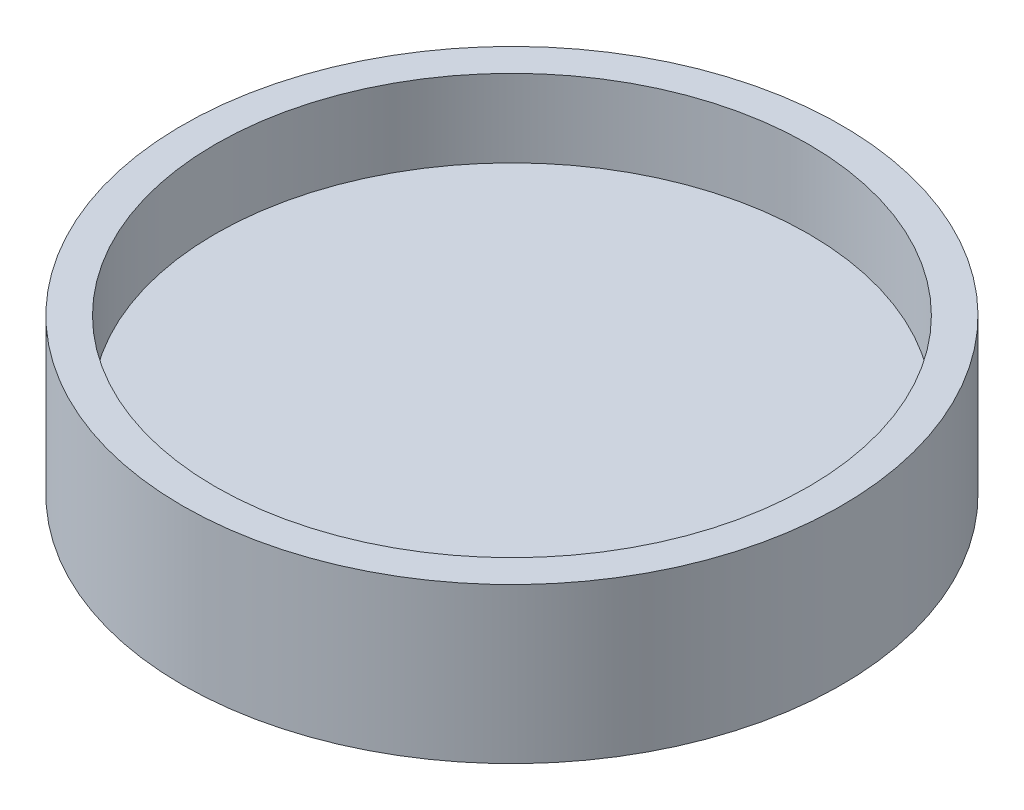
ISO-10303-21;
HEADER;
FILE_DESCRIPTION(('STEP AP214'),'2;1');
FILE_NAME('part.step','',(''),(''),'','','');
FILE_SCHEMA(('AUTOMOTIVE_DESIGN { 1 0 10303 214 1 1 1 1 }'));
ENDSEC;
DATA;
#1=APPLICATION_CONTEXT('core data for automotive mechanical design processes');
#2=APPLICATION_PROTOCOL_DEFINITION('international standard','automotive_design',2000,#1);
#3=PRODUCT_CONTEXT('',#1,'mechanical');
#4=PRODUCT('Part','Part','',(#3));
#5=PRODUCT_RELATED_PRODUCT_CATEGORY('part','',(#4));
#6=PRODUCT_DEFINITION_FORMATION('','',#4);
#7=PRODUCT_DEFINITION_CONTEXT('part definition',#1,'design');
#8=PRODUCT_DEFINITION('design','',#6,#7);
#9=PRODUCT_DEFINITION_SHAPE('','',#8);
#10=(LENGTH_UNIT() NAMED_UNIT(*) SI_UNIT(.MILLI.,.METRE.));
#11=(NAMED_UNIT(*) PLANE_ANGLE_UNIT() SI_UNIT($,.RADIAN.));
#12=(NAMED_UNIT(*) SI_UNIT($,.STERADIAN.) SOLID_ANGLE_UNIT());
#13=UNCERTAINTY_MEASURE_WITH_UNIT(LENGTH_MEASURE(1.E-05),#10,'distance_accuracy_value','');
#14=(GEOMETRIC_REPRESENTATION_CONTEXT(3) GLOBAL_UNCERTAINTY_ASSIGNED_CONTEXT((#13)) GLOBAL_UNIT_ASSIGNED_CONTEXT((#10,
#11,#12)) REPRESENTATION_CONTEXT('',''));
#15=CARTESIAN_POINT('',(0.,0.,0.));
#16=DIRECTION('',(0.,0.,1.));
#17=DIRECTION('',(1.,0.,0.));
#18=AXIS2_PLACEMENT_3D('',#15,#16,#17);
#19=CARTESIAN_POINT('',(0.,4.,0.));
#20=DIRECTION('',(0.,-1.,0.));
#21=DIRECTION('',(0.,0.,-1.));
#22=AXIS2_PLACEMENT_3D('',#19,#20,#21);
#23=CYLINDRICAL_SURFACE('',#22,8.5);
#24=CARTESIAN_POINT('',(0.,4.,0.));
#25=DIRECTION('',(0.,1.,0.));
#26=DIRECTION('',(0.,0.,1.));
#27=AXIS2_PLACEMENT_3D('',#24,#25,#26);
#28=CIRCLE('',#27,8.5);
#29=CARTESIAN_POINT('',(0.,4.,8.5));
#30=VERTEX_POINT('',#29);
#31=EDGE_CURVE('E10',#30,#30,#28,.T.);
#32=ORIENTED_EDGE('',*,*,#31,.F.);
#33=EDGE_LOOP('',(#32));
#34=FACE_BOUND('',#33,.T.);
#35=CARTESIAN_POINT('',(0.,0.,0.));
#36=DIRECTION('',(0.,1.,0.));
#37=DIRECTION('',(0.,0.,1.));
#38=AXIS2_PLACEMENT_3D('',#35,#36,#37);
#39=CIRCLE('',#38,8.5);
#40=CARTESIAN_POINT('',(0.,0.,8.5));
#41=VERTEX_POINT('',#40);
#42=EDGE_CURVE('E34',#41,#41,#39,.T.);
#43=ORIENTED_EDGE('',*,*,#42,.T.);
#44=EDGE_LOOP('',(#43));
#45=FACE_BOUND('',#44,.T.);
#46=ADVANCED_FACE('F31',(#34,#45),#23,.T.);
#47=CARTESIAN_POINT('',(0.,4.,0.));
#48=DIRECTION('',(0.,1.,0.));
#49=DIRECTION('',(0.,0.,1.));
#50=AXIS2_PLACEMENT_3D('',#47,#48,#49);
#51=PLANE('',#50);
#52=CARTESIAN_POINT('',(0.,4.,0.));
#53=DIRECTION('',(0.,1.,0.));
#54=DIRECTION('',(0.,0.,1.));
#55=AXIS2_PLACEMENT_3D('',#52,#53,#54);
#56=CIRCLE('',#55,7.65);
#57=CARTESIAN_POINT('',(0.,4.,7.65));
#58=VERTEX_POINT('',#57);
#59=EDGE_CURVE('E43',#58,#58,#56,.T.);
#60=ORIENTED_EDGE('',*,*,#59,.F.);
#61=EDGE_LOOP('',(#60));
#62=FACE_BOUND('',#61,.T.);
#63=ORIENTED_EDGE('',*,*,#31,.T.);
#64=EDGE_LOOP('',(#63));
#65=FACE_BOUND('',#64,.T.);
#66=ADVANCED_FACE('F58',(#62,#65),#51,.T.);
#67=CARTESIAN_POINT('',(0.,0.,0.));
#68=DIRECTION('',(0.,1.,0.));
#69=DIRECTION('',(0.,0.,1.));
#70=AXIS2_PLACEMENT_3D('',#67,#68,#69);
#71=PLANE('',#70);
#72=ORIENTED_EDGE('',*,*,#42,.F.);
#73=EDGE_LOOP('',(#72));
#74=FACE_BOUND('',#73,.T.);
#75=ADVANCED_FACE('F54',(#74),#71,.F.);
#76=CARTESIAN_POINT('',(0.,2.,0.));
#77=DIRECTION('',(0.,1.,0.));
#78=DIRECTION('',(0.,0.,1.));
#79=AXIS2_PLACEMENT_3D('',#76,#77,#78);
#80=CYLINDRICAL_SURFACE('',#79,7.65);
#81=CARTESIAN_POINT('',(0.,2.,0.));
#82=DIRECTION('',(0.,1.,0.));
#83=DIRECTION('',(0.,0.,1.));
#84=AXIS2_PLACEMENT_3D('',#81,#82,#83);
#85=CIRCLE('',#84,7.65);
#86=CARTESIAN_POINT('',(0.,2.,7.65));
#87=VERTEX_POINT('',#86);
#88=EDGE_CURVE('E41',#87,#87,#85,.T.);
#89=ORIENTED_EDGE('',*,*,#88,.F.);
#90=EDGE_LOOP('',(#89));
#91=FACE_BOUND('',#90,.T.);
#92=ORIENTED_EDGE('',*,*,#59,.T.);
#93=EDGE_LOOP('',(#92));
#94=FACE_BOUND('',#93,.T.);
#95=ADVANCED_FACE('F51',(#91,#94),#80,.F.);
#96=CARTESIAN_POINT('',(0.,2.,0.));
#97=DIRECTION('',(0.,1.,0.));
#98=DIRECTION('',(0.,0.,1.));
#99=AXIS2_PLACEMENT_3D('',#96,#97,#98);
#100=PLANE('',#99);
#101=ORIENTED_EDGE('',*,*,#88,.T.);
#102=EDGE_LOOP('',(#101));
#103=FACE_BOUND('',#102,.T.);
#104=ADVANCED_FACE('F49',(#103),#100,.T.);
#105=CLOSED_SHELL('',(#46,#66,#75,#95,#104));
#106=MANIFOLD_SOLID_BREP('B2',#105);
#107=ADVANCED_BREP_SHAPE_REPRESENTATION('',(#18,#106),#14);
#108=SHAPE_DEFINITION_REPRESENTATION(#9,#107);
ENDSEC;
END-ISO-10303-21;
